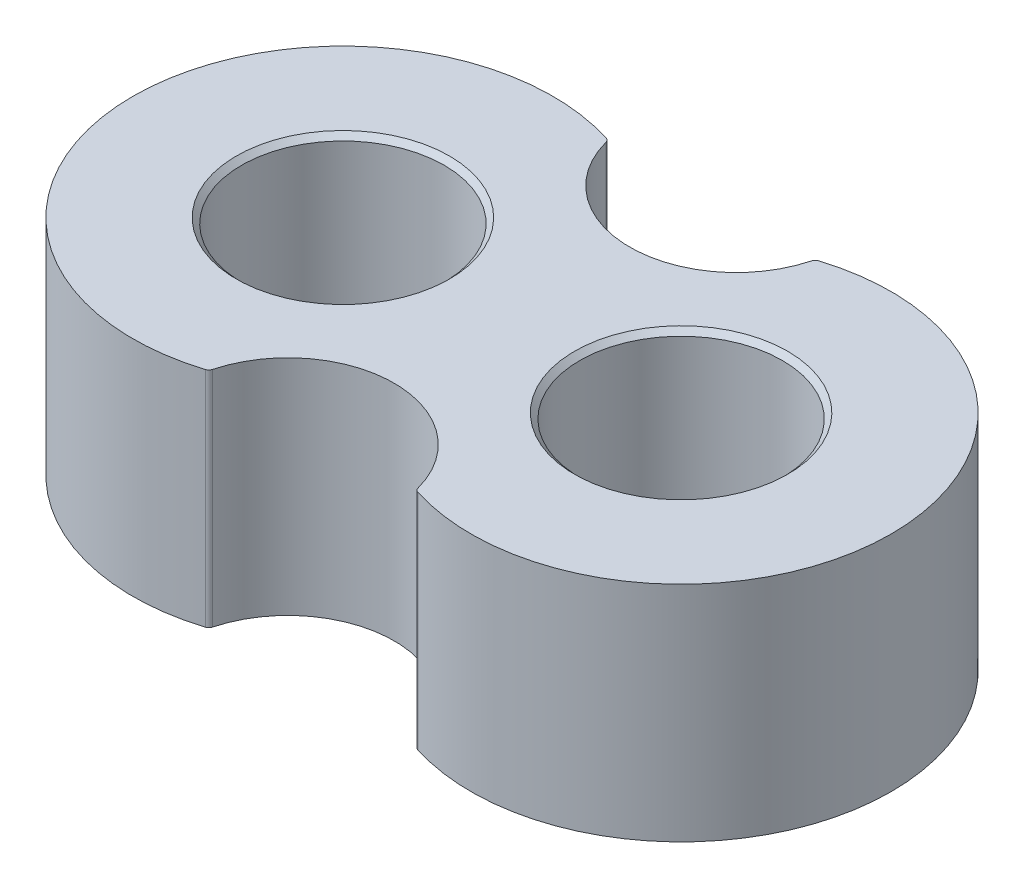
ISO-10303-21;
HEADER;
FILE_DESCRIPTION(('STEP AP214'),'2;1');
FILE_NAME('part.step','',(''),(''),'','','');
FILE_SCHEMA(('AUTOMOTIVE_DESIGN { 1 0 10303 214 1 1 1 1 }'));
ENDSEC;
DATA;
#1=APPLICATION_CONTEXT('core data for automotive mechanical design processes');
#2=APPLICATION_PROTOCOL_DEFINITION('international standard','automotive_design',2000,#1);
#3=PRODUCT_CONTEXT('',#1,'mechanical');
#4=PRODUCT('Part','Part','',(#3));
#5=PRODUCT_RELATED_PRODUCT_CATEGORY('part','',(#4));
#6=PRODUCT_DEFINITION_FORMATION('','',#4);
#7=PRODUCT_DEFINITION_CONTEXT('part definition',#1,'design');
#8=PRODUCT_DEFINITION('design','',#6,#7);
#9=PRODUCT_DEFINITION_SHAPE('','',#8);
#10=(LENGTH_UNIT() NAMED_UNIT(*) SI_UNIT(.MILLI.,.METRE.));
#11=(NAMED_UNIT(*) PLANE_ANGLE_UNIT() SI_UNIT($,.RADIAN.));
#12=(NAMED_UNIT(*) SI_UNIT($,.STERADIAN.) SOLID_ANGLE_UNIT());
#13=UNCERTAINTY_MEASURE_WITH_UNIT(LENGTH_MEASURE(1.E-05),#10,'distance_accuracy_value','');
#14=(GEOMETRIC_REPRESENTATION_CONTEXT(3) GLOBAL_UNCERTAINTY_ASSIGNED_CONTEXT((#13)) GLOBAL_UNIT_ASSIGNED_CONTEXT((#10,
#11,#12)) REPRESENTATION_CONTEXT('',''));
#15=CARTESIAN_POINT('',(0.,0.,0.));
#16=DIRECTION('',(0.,0.,1.));
#17=DIRECTION('',(1.,0.,0.));
#18=AXIS2_PLACEMENT_3D('',#15,#16,#17);
#19=CARTESIAN_POINT('',(-13.0227641960405,20.985,9.18488645157975));
#20=DIRECTION('',(0.,-1.,0.));
#21=DIRECTION('',(0.,0.,-1.));
#22=AXIS2_PLACEMENT_3D('',#19,#20,#21);
#23=PLANE('',#22);
#24=CARTESIAN_POINT('',(15.9,20.985,0.));
#25=DIRECTION('',(0.,-1.,0.));
#26=DIRECTION('',(0.,0.,-1.));
#27=AXIS2_PLACEMENT_3D('',#24,#25,#26);
#28=CIRCLE('',#27,10.025);
#29=CARTESIAN_POINT('',(15.9,20.985,-10.025));
#30=VERTEX_POINT('',#29);
#31=EDGE_CURVE('E11',#30,#30,#28,.T.);
#32=ORIENTED_EDGE('',*,*,#31,.T.);
#33=EDGE_LOOP('',(#32));
#34=FACE_BOUND('',#33,.T.);
#35=CARTESIAN_POINT('',(-15.9,20.985,0.));
#36=DIRECTION('',(0.,-1.,0.));
#37=DIRECTION('',(0.,0.,-1.));
#38=AXIS2_PLACEMENT_3D('',#35,#36,#37);
#39=CIRCLE('',#38,10.025);
#40=CARTESIAN_POINT('',(-15.9,20.985,-10.025));
#41=VERTEX_POINT('',#40);
#42=EDGE_CURVE('E49',#41,#41,#39,.T.);
#43=ORIENTED_EDGE('',*,*,#42,.T.);
#44=EDGE_LOOP('',(#43));
#45=FACE_BOUND('',#44,.T.);
#46=CARTESIAN_POINT('',(-10.1455283920809,20.985,18.3697729031595));
#47=DIRECTION('',(0.,1.,0.));
#48=DIRECTION('',(0.,0.,-1.));
#49=AXIS2_PLACEMENT_3D('',#46,#47,#48);
#50=CIRCLE('',#49,0.499999999999998);
#51=CARTESIAN_POINT('',(-9.99606159707003,20.985,18.8469098616831));
#52=VERTEX_POINT('',#51);
#53=CARTESIAN_POINT('',(-9.66240799245801,20.985,18.4985932411043));
#54=VERTEX_POINT('',#53);
#55=EDGE_CURVE('E151',#52,#54,#50,.T.);
#56=ORIENTED_EDGE('',*,*,#55,.T.);
#57=CARTESIAN_POINT('',(0.,20.985,21.075));
#58=DIRECTION('',(0.,-1.,0.));
#59=DIRECTION('',(0.,0.,-1.));
#60=AXIS2_PLACEMENT_3D('',#57,#58,#59);
#61=CIRCLE('',#60,10.);
#62=CARTESIAN_POINT('',(9.66240799245801,20.985,18.4985932411043));
#63=VERTEX_POINT('',#62);
#64=EDGE_CURVE('E101',#54,#63,#61,.T.);
#65=ORIENTED_EDGE('',*,*,#64,.T.);
#66=CARTESIAN_POINT('',(10.1455283920809,20.985,18.3697729031595));
#67=DIRECTION('',(0.,1.,0.));
#68=DIRECTION('',(0.,0.,1.));
#69=AXIS2_PLACEMENT_3D('',#66,#67,#68);
#70=CIRCLE('',#69,0.499999999999999);
#71=CARTESIAN_POINT('',(9.99606159707003,20.985,18.8469098616831));
#72=VERTEX_POINT('',#71);
#73=EDGE_CURVE('E396',#63,#72,#70,.T.);
#74=ORIENTED_EDGE('',*,*,#73,.T.);
#75=CARTESIAN_POINT('',(15.9,20.985,0.));
#76=DIRECTION('',(0.,1.,0.));
#77=DIRECTION('',(0.,0.,1.));
#78=AXIS2_PLACEMENT_3D('',#75,#76,#77);
#79=CIRCLE('',#78,19.75);
#80=CARTESIAN_POINT('',(9.99606159707002,20.985,-18.8469098616831));
#81=VERTEX_POINT('',#80);
#82=EDGE_CURVE('E400',#72,#81,#79,.T.);
#83=ORIENTED_EDGE('',*,*,#82,.T.);
#84=CARTESIAN_POINT('',(10.1455283920809,20.985,-18.3697729031595));
#85=DIRECTION('',(0.,1.,0.));
#86=DIRECTION('',(0.,0.,1.));
#87=AXIS2_PLACEMENT_3D('',#84,#85,#86);
#88=CIRCLE('',#87,0.499999999999999);
#89=CARTESIAN_POINT('',(9.66240799245801,20.985,-18.4985932411043));
#90=VERTEX_POINT('',#89);
#91=EDGE_CURVE('E119',#81,#90,#88,.T.);
#92=ORIENTED_EDGE('',*,*,#91,.T.);
#93=CARTESIAN_POINT('',(0.,20.985,-21.075));
#94=DIRECTION('',(0.,-1.,0.));
#95=DIRECTION('',(0.,0.,1.));
#96=AXIS2_PLACEMENT_3D('',#93,#94,#95);
#97=CIRCLE('',#96,10.);
#98=CARTESIAN_POINT('',(-9.66240799245801,20.985,-18.4985932411043));
#99=VERTEX_POINT('',#98);
#100=EDGE_CURVE('E114',#90,#99,#97,.T.);
#101=ORIENTED_EDGE('',*,*,#100,.T.);
#102=CARTESIAN_POINT('',(-10.1455283920809,20.985,-18.3697729031595));
#103=DIRECTION('',(0.,1.,0.));
#104=DIRECTION('',(0.,0.,-1.));
#105=AXIS2_PLACEMENT_3D('',#102,#103,#104);
#106=CIRCLE('',#105,0.499999999999998);
#107=CARTESIAN_POINT('',(-9.99606159707003,20.985,-18.8469098616831));
#108=VERTEX_POINT('',#107);
#109=EDGE_CURVE('E117',#99,#108,#106,.T.);
#110=ORIENTED_EDGE('',*,*,#109,.T.);
#111=CARTESIAN_POINT('',(-15.9,20.985,0.));
#112=DIRECTION('',(0.,1.,0.));
#113=DIRECTION('',(0.,0.,-1.));
#114=AXIS2_PLACEMENT_3D('',#111,#112,#113);
#115=CIRCLE('',#114,19.75);
#116=EDGE_CURVE('E57',#108,#52,#115,.T.);
#117=ORIENTED_EDGE('',*,*,#116,.T.);
#118=EDGE_LOOP('',(#56,#65,#74,#83,#92,#101,#110,#117));
#119=FACE_BOUND('',#118,.T.);
#120=ADVANCED_FACE('F39',(#34,#45,#119),#23,.F.);
#121=CARTESIAN_POINT('',(-13.0227641960405,0.,9.18488645157975));
#122=DIRECTION('',(0.,-1.,0.));
#123=DIRECTION('',(0.,0.,-1.));
#124=AXIS2_PLACEMENT_3D('',#121,#122,#123);
#125=PLANE('',#124);
#126=CARTESIAN_POINT('',(-15.9,0.,0.));
#127=DIRECTION('',(0.,-1.,0.));
#128=DIRECTION('',(0.,0.,-1.));
#129=AXIS2_PLACEMENT_3D('',#126,#127,#128);
#130=CIRCLE('',#129,10.025);
#131=CARTESIAN_POINT('',(-15.9,0.,-10.025));
#132=VERTEX_POINT('',#131);
#133=EDGE_CURVE('E169',#132,#132,#130,.F.);
#134=ORIENTED_EDGE('',*,*,#133,.T.);
#135=EDGE_LOOP('',(#134));
#136=FACE_BOUND('',#135,.T.);
#137=CARTESIAN_POINT('',(15.9,0.,0.));
#138=DIRECTION('',(0.,-1.,0.));
#139=DIRECTION('',(0.,0.,-1.));
#140=AXIS2_PLACEMENT_3D('',#137,#138,#139);
#141=CIRCLE('',#140,10.025);
#142=CARTESIAN_POINT('',(15.9,0.,-10.025));
#143=VERTEX_POINT('',#142);
#144=EDGE_CURVE('E166',#143,#143,#141,.F.);
#145=ORIENTED_EDGE('',*,*,#144,.T.);
#146=EDGE_LOOP('',(#145));
#147=FACE_BOUND('',#146,.T.);
#148=CARTESIAN_POINT('',(-10.1455283920809,0.,18.3697729031595));
#149=DIRECTION('',(0.,1.,0.));
#150=DIRECTION('',(0.,0.,-1.));
#151=AXIS2_PLACEMENT_3D('',#148,#149,#150);
#152=CIRCLE('',#151,0.499999999999998);
#153=CARTESIAN_POINT('',(-9.99606159707003,0.,18.8469098616831));
#154=VERTEX_POINT('',#153);
#155=CARTESIAN_POINT('',(-9.66240799245801,0.,18.4985932411043));
#156=VERTEX_POINT('',#155);
#157=EDGE_CURVE('E137',#154,#156,#152,.T.);
#158=ORIENTED_EDGE('',*,*,#157,.F.);
#159=CARTESIAN_POINT('',(-15.9,0.,0.));
#160=DIRECTION('',(0.,1.,0.));
#161=DIRECTION('',(0.,0.,-1.));
#162=AXIS2_PLACEMENT_3D('',#159,#160,#161);
#163=CIRCLE('',#162,19.75);
#164=CARTESIAN_POINT('',(-9.99606159707003,0.,-18.8469098616831));
#165=VERTEX_POINT('',#164);
#166=EDGE_CURVE('E92',#165,#154,#163,.T.);
#167=ORIENTED_EDGE('',*,*,#166,.F.);
#168=CARTESIAN_POINT('',(-10.1455283920809,0.,-18.3697729031595));
#169=DIRECTION('',(0.,1.,0.));
#170=DIRECTION('',(0.,0.,-1.));
#171=AXIS2_PLACEMENT_3D('',#168,#169,#170);
#172=CIRCLE('',#171,0.499999999999998);
#173=CARTESIAN_POINT('',(-9.66240799245801,0.,-18.4985932411043));
#174=VERTEX_POINT('',#173);
#175=EDGE_CURVE('E86',#174,#165,#172,.T.);
#176=ORIENTED_EDGE('',*,*,#175,.F.);
#177=CARTESIAN_POINT('',(0.,0.,-21.075));
#178=DIRECTION('',(0.,-1.,0.));
#179=DIRECTION('',(0.,0.,1.));
#180=AXIS2_PLACEMENT_3D('',#177,#178,#179);
#181=CIRCLE('',#180,10.);
#182=CARTESIAN_POINT('',(9.66240799245801,0.,-18.4985932411043));
#183=VERTEX_POINT('',#182);
#184=EDGE_CURVE('E127',#183,#174,#181,.T.);
#185=ORIENTED_EDGE('',*,*,#184,.F.);
#186=CARTESIAN_POINT('',(10.1455283920809,0.,-18.3697729031595));
#187=DIRECTION('',(0.,1.,0.));
#188=DIRECTION('',(0.,0.,1.));
#189=AXIS2_PLACEMENT_3D('',#186,#187,#188);
#190=CIRCLE('',#189,0.499999999999999);
#191=CARTESIAN_POINT('',(9.99606159707002,0.,-18.8469098616831));
#192=VERTEX_POINT('',#191);
#193=EDGE_CURVE('E146',#192,#183,#190,.T.);
#194=ORIENTED_EDGE('',*,*,#193,.F.);
#195=CARTESIAN_POINT('',(15.9,0.,0.));
#196=DIRECTION('',(0.,1.,0.));
#197=DIRECTION('',(0.,0.,1.));
#198=AXIS2_PLACEMENT_3D('',#195,#196,#197);
#199=CIRCLE('',#198,19.75);
#200=CARTESIAN_POINT('',(9.99606159707003,0.,18.8469098616831));
#201=VERTEX_POINT('',#200);
#202=EDGE_CURVE('E144',#201,#192,#199,.T.);
#203=ORIENTED_EDGE('',*,*,#202,.F.);
#204=CARTESIAN_POINT('',(10.1455283920809,0.,18.3697729031595));
#205=DIRECTION('',(0.,1.,0.));
#206=DIRECTION('',(0.,0.,1.));
#207=AXIS2_PLACEMENT_3D('',#204,#205,#206);
#208=CIRCLE('',#207,0.499999999999999);
#209=CARTESIAN_POINT('',(9.66240799245801,0.,18.4985932411043));
#210=VERTEX_POINT('',#209);
#211=EDGE_CURVE('E142',#210,#201,#208,.T.);
#212=ORIENTED_EDGE('',*,*,#211,.F.);
#213=CARTESIAN_POINT('',(0.,0.,21.075));
#214=DIRECTION('',(0.,-1.,0.));
#215=DIRECTION('',(0.,0.,-1.));
#216=AXIS2_PLACEMENT_3D('',#213,#214,#215);
#217=CIRCLE('',#216,10.);
#218=EDGE_CURVE('E140',#156,#210,#217,.T.);
#219=ORIENTED_EDGE('',*,*,#218,.F.);
#220=EDGE_LOOP('',(#158,#167,#176,#185,#194,#203,#212,#219));
#221=FACE_BOUND('',#220,.T.);
#222=ADVANCED_FACE('F208',(#136,#147,#221),#125,.T.);
#223=CARTESIAN_POINT('',(-10.1455283920809,20.985,18.3697729031595));
#224=DIRECTION('',(0.,-1.,0.));
#225=DIRECTION('',(0.,0.,-1.));
#226=AXIS2_PLACEMENT_3D('',#223,#224,#225);
#227=CYLINDRICAL_SURFACE('',#226,0.499999999999998);
#228=ORIENTED_EDGE('',*,*,#157,.T.);
#229=DIRECTION('',(0.,-1.,0.));
#230=VECTOR('',#229,1.);
#231=CARTESIAN_POINT('',(-9.66240799245801,20.985,18.4985932411043));
#232=LINE('',#231,#230);
#233=EDGE_CURVE('E164',#54,#156,#232,.T.);
#234=ORIENTED_EDGE('',*,*,#233,.F.);
#235=ORIENTED_EDGE('',*,*,#55,.F.);
#236=DIRECTION('',(0.,-1.,0.));
#237=VECTOR('',#236,1.);
#238=CARTESIAN_POINT('',(-9.99606159707003,20.985,18.8469098616831));
#239=LINE('',#238,#237);
#240=EDGE_CURVE('E133',#52,#154,#239,.T.);
#241=ORIENTED_EDGE('',*,*,#240,.T.);
#242=EDGE_LOOP('',(#228,#234,#235,#241));
#243=FACE_BOUND('',#242,.T.);
#244=ADVANCED_FACE('F213',(#243),#227,.T.);
#245=CARTESIAN_POINT('',(0.,20.985,21.075));
#246=DIRECTION('',(0.,-1.,0.));
#247=DIRECTION('',(0.,0.,-1.));
#248=AXIS2_PLACEMENT_3D('',#245,#246,#247);
#249=CYLINDRICAL_SURFACE('',#248,10.);
#250=ORIENTED_EDGE('',*,*,#218,.T.);
#251=DIRECTION('',(0.,-1.,0.));
#252=VECTOR('',#251,1.);
#253=CARTESIAN_POINT('',(9.66240799245801,20.985,18.4985932411043));
#254=LINE('',#253,#252);
#255=EDGE_CURVE('E161',#63,#210,#254,.T.);
#256=ORIENTED_EDGE('',*,*,#255,.F.);
#257=ORIENTED_EDGE('',*,*,#64,.F.);
#258=ORIENTED_EDGE('',*,*,#233,.T.);
#259=EDGE_LOOP('',(#250,#256,#257,#258));
#260=FACE_BOUND('',#259,.T.);
#261=ADVANCED_FACE('F232',(#260),#249,.F.);
#262=CARTESIAN_POINT('',(10.1455283920809,20.985,18.3697729031595));
#263=DIRECTION('',(0.,-1.,0.));
#264=DIRECTION('',(0.,0.,-1.));
#265=AXIS2_PLACEMENT_3D('',#262,#263,#264);
#266=CYLINDRICAL_SURFACE('',#265,0.499999999999999);
#267=ORIENTED_EDGE('',*,*,#211,.T.);
#268=DIRECTION('',(0.,-1.,0.));
#269=VECTOR('',#268,1.);
#270=CARTESIAN_POINT('',(9.99606159707003,20.985,18.8469098616831));
#271=LINE('',#270,#269);
#272=EDGE_CURVE('E158',#72,#201,#271,.T.);
#273=ORIENTED_EDGE('',*,*,#272,.F.);
#274=ORIENTED_EDGE('',*,*,#73,.F.);
#275=ORIENTED_EDGE('',*,*,#255,.T.);
#276=EDGE_LOOP('',(#267,#273,#274,#275));
#277=FACE_BOUND('',#276,.T.);
#278=ADVANCED_FACE('F228',(#277),#266,.T.);
#279=CARTESIAN_POINT('',(15.9,20.985,0.));
#280=DIRECTION('',(0.,-1.,0.));
#281=DIRECTION('',(0.,0.,-1.));
#282=AXIS2_PLACEMENT_3D('',#279,#280,#281);
#283=CYLINDRICAL_SURFACE('',#282,19.75);
#284=ORIENTED_EDGE('',*,*,#202,.T.);
#285=DIRECTION('',(0.,-1.,0.));
#286=VECTOR('',#285,1.);
#287=CARTESIAN_POINT('',(9.99606159707002,20.985,-18.8469098616831));
#288=LINE('',#287,#286);
#289=EDGE_CURVE('E155',#81,#192,#288,.T.);
#290=ORIENTED_EDGE('',*,*,#289,.F.);
#291=ORIENTED_EDGE('',*,*,#82,.F.);
#292=ORIENTED_EDGE('',*,*,#272,.T.);
#293=EDGE_LOOP('',(#284,#290,#291,#292));
#294=FACE_BOUND('',#293,.T.);
#295=ADVANCED_FACE('F224',(#294),#283,.T.);
#296=CARTESIAN_POINT('',(10.1455283920809,20.985,-18.3697729031595));
#297=DIRECTION('',(0.,-1.,0.));
#298=DIRECTION('',(0.,0.,-1.));
#299=AXIS2_PLACEMENT_3D('',#296,#297,#298);
#300=CYLINDRICAL_SURFACE('',#299,0.499999999999999);
#301=ORIENTED_EDGE('',*,*,#193,.T.);
#302=DIRECTION('',(0.,-1.,0.));
#303=VECTOR('',#302,1.);
#304=CARTESIAN_POINT('',(9.66240799245801,20.985,-18.4985932411043));
#305=LINE('',#304,#303);
#306=EDGE_CURVE('E128',#90,#183,#305,.T.);
#307=ORIENTED_EDGE('',*,*,#306,.F.);
#308=ORIENTED_EDGE('',*,*,#91,.F.);
#309=ORIENTED_EDGE('',*,*,#289,.T.);
#310=EDGE_LOOP('',(#301,#307,#308,#309));
#311=FACE_BOUND('',#310,.T.);
#312=ADVANCED_FACE('F221',(#311),#300,.T.);
#313=CARTESIAN_POINT('',(0.,20.985,-21.075));
#314=DIRECTION('',(0.,-1.,0.));
#315=DIRECTION('',(0.,0.,-1.));
#316=AXIS2_PLACEMENT_3D('',#313,#314,#315);
#317=CYLINDRICAL_SURFACE('',#316,10.);
#318=ORIENTED_EDGE('',*,*,#184,.T.);
#319=DIRECTION('',(0.,-1.,0.));
#320=VECTOR('',#319,1.);
#321=CARTESIAN_POINT('',(-9.66240799245801,20.985,-18.4985932411043));
#322=LINE('',#321,#320);
#323=EDGE_CURVE('E124',#99,#174,#322,.T.);
#324=ORIENTED_EDGE('',*,*,#323,.F.);
#325=ORIENTED_EDGE('',*,*,#100,.F.);
#326=ORIENTED_EDGE('',*,*,#306,.T.);
#327=EDGE_LOOP('',(#318,#324,#325,#326));
#328=FACE_BOUND('',#327,.T.);
#329=ADVANCED_FACE('F125',(#328),#317,.F.);
#330=CARTESIAN_POINT('',(-10.1455283920809,20.985,-18.3697729031595));
#331=DIRECTION('',(0.,-1.,0.));
#332=DIRECTION('',(0.,0.,-1.));
#333=AXIS2_PLACEMENT_3D('',#330,#331,#332);
#334=CYLINDRICAL_SURFACE('',#333,0.499999999999998);
#335=ORIENTED_EDGE('',*,*,#175,.T.);
#336=DIRECTION('',(0.,-1.,0.));
#337=VECTOR('',#336,1.);
#338=CARTESIAN_POINT('',(-9.99606159707003,20.985,-18.8469098616831));
#339=LINE('',#338,#337);
#340=EDGE_CURVE('E129',#108,#165,#339,.T.);
#341=ORIENTED_EDGE('',*,*,#340,.F.);
#342=ORIENTED_EDGE('',*,*,#109,.F.);
#343=ORIENTED_EDGE('',*,*,#323,.T.);
#344=EDGE_LOOP('',(#335,#341,#342,#343));
#345=FACE_BOUND('',#344,.T.);
#346=ADVANCED_FACE('F131',(#345),#334,.T.);
#347=CARTESIAN_POINT('',(-15.9,20.985,0.));
#348=DIRECTION('',(0.,-1.,0.));
#349=DIRECTION('',(0.,0.,-1.));
#350=AXIS2_PLACEMENT_3D('',#347,#348,#349);
#351=CYLINDRICAL_SURFACE('',#350,19.75);
#352=ORIENTED_EDGE('',*,*,#166,.T.);
#353=ORIENTED_EDGE('',*,*,#240,.F.);
#354=ORIENTED_EDGE('',*,*,#116,.F.);
#355=ORIENTED_EDGE('',*,*,#340,.T.);
#356=EDGE_LOOP('',(#352,#353,#354,#355));
#357=FACE_BOUND('',#356,.T.);
#358=ADVANCED_FACE('F195',(#357),#351,.T.);
#359=CARTESIAN_POINT('',(-15.9,20.985,0.));
#360=DIRECTION('',(0.,-1.,0.));
#361=DIRECTION('',(0.,0.,-1.));
#362=AXIS2_PLACEMENT_3D('',#359,#360,#361);
#363=CYLINDRICAL_SURFACE('',#362,9.525);
#364=CARTESIAN_POINT('',(-15.9,0.499999999999983,0.));
#365=DIRECTION('',(0.,-1.,0.));
#366=DIRECTION('',(0.,0.,-1.));
#367=AXIS2_PLACEMENT_3D('',#364,#365,#366);
#368=CIRCLE('',#367,9.525);
#369=CARTESIAN_POINT('',(-15.9,0.499999999999983,-9.525));
#370=VERTEX_POINT('',#369);
#371=EDGE_CURVE('E175',#370,#370,#368,.T.);
#372=ORIENTED_EDGE('',*,*,#371,.T.);
#373=EDGE_LOOP('',(#372));
#374=FACE_BOUND('',#373,.T.);
#375=CARTESIAN_POINT('',(-15.9,20.485,0.));
#376=DIRECTION('',(0.,-1.,0.));
#377=DIRECTION('',(0.,0.,-1.));
#378=AXIS2_PLACEMENT_3D('',#375,#376,#377);
#379=CIRCLE('',#378,9.525);
#380=CARTESIAN_POINT('',(-15.9,20.485,-9.525));
#381=VERTEX_POINT('',#380);
#382=EDGE_CURVE('E172',#381,#381,#379,.F.);
#383=ORIENTED_EDGE('',*,*,#382,.T.);
#384=EDGE_LOOP('',(#383));
#385=FACE_BOUND('',#384,.T.);
#386=ADVANCED_FACE('F192',(#374,#385),#363,.F.);
#387=CARTESIAN_POINT('',(15.9,20.985,0.));
#388=DIRECTION('',(0.,-1.,0.));
#389=DIRECTION('',(0.,0.,-1.));
#390=AXIS2_PLACEMENT_3D('',#387,#388,#389);
#391=CYLINDRICAL_SURFACE('',#390,9.525);
#392=CARTESIAN_POINT('',(15.9,0.500000000000004,0.));
#393=DIRECTION('',(0.,-1.,0.));
#394=DIRECTION('',(0.,0.,-1.));
#395=AXIS2_PLACEMENT_3D('',#392,#393,#394);
#396=CIRCLE('',#395,9.525);
#397=CARTESIAN_POINT('',(15.9,0.500000000000004,-9.525));
#398=VERTEX_POINT('',#397);
#399=EDGE_CURVE('E181',#398,#398,#396,.T.);
#400=ORIENTED_EDGE('',*,*,#399,.T.);
#401=EDGE_LOOP('',(#400));
#402=FACE_BOUND('',#401,.T.);
#403=CARTESIAN_POINT('',(15.9,20.485,0.));
#404=DIRECTION('',(0.,-1.,0.));
#405=DIRECTION('',(0.,0.,-1.));
#406=AXIS2_PLACEMENT_3D('',#403,#404,#405);
#407=CIRCLE('',#406,9.525);
#408=CARTESIAN_POINT('',(15.9,20.485,-9.525));
#409=VERTEX_POINT('',#408);
#410=EDGE_CURVE('E178',#409,#409,#407,.F.);
#411=ORIENTED_EDGE('',*,*,#410,.T.);
#412=EDGE_LOOP('',(#411));
#413=FACE_BOUND('',#412,.T.);
#414=ADVANCED_FACE('F194',(#402,#413),#391,.F.);
#415=CARTESIAN_POINT('',(-15.9,0.,0.));
#416=DIRECTION('',(0.,-1.,0.));
#417=DIRECTION('',(0.,0.,-1.));
#418=AXIS2_PLACEMENT_3D('',#415,#416,#417);
#419=CONICAL_SURFACE('',#418,10.025,0.785398163397443);
#420=ORIENTED_EDGE('',*,*,#371,.F.);
#421=EDGE_LOOP('',(#420));
#422=FACE_BOUND('',#421,.T.);
#423=ORIENTED_EDGE('',*,*,#133,.F.);
#424=EDGE_LOOP('',(#423));
#425=FACE_BOUND('',#424,.T.);
#426=ADVANCED_FACE('F202',(#422,#425),#419,.F.);
#427=CARTESIAN_POINT('',(15.9,0.,0.));
#428=DIRECTION('',(0.,-1.,0.));
#429=DIRECTION('',(0.,0.,-1.));
#430=AXIS2_PLACEMENT_3D('',#427,#428,#429);
#431=CONICAL_SURFACE('',#430,10.025,0.785398163397447);
#432=ORIENTED_EDGE('',*,*,#399,.F.);
#433=EDGE_LOOP('',(#432));
#434=FACE_BOUND('',#433,.T.);
#435=ORIENTED_EDGE('',*,*,#144,.F.);
#436=EDGE_LOOP('',(#435));
#437=FACE_BOUND('',#436,.T.);
#438=ADVANCED_FACE('F245',(#434,#437),#431,.F.);
#439=CARTESIAN_POINT('',(15.9,20.485,0.));
#440=DIRECTION('',(0.,1.,0.));
#441=DIRECTION('',(0.,0.,1.));
#442=AXIS2_PLACEMENT_3D('',#439,#440,#441);
#443=CONICAL_SURFACE('',#442,9.525,0.785398163397453);
#444=ORIENTED_EDGE('',*,*,#31,.F.);
#445=EDGE_LOOP('',(#444));
#446=FACE_BOUND('',#445,.T.);
#447=ORIENTED_EDGE('',*,*,#410,.F.);
#448=EDGE_LOOP('',(#447));
#449=FACE_BOUND('',#448,.T.);
#450=ADVANCED_FACE('F189',(#446,#449),#443,.F.);
#451=CARTESIAN_POINT('',(-15.9,20.485,0.));
#452=DIRECTION('',(0.,1.,0.));
#453=DIRECTION('',(0.,0.,1.));
#454=AXIS2_PLACEMENT_3D('',#451,#452,#453);
#455=CONICAL_SURFACE('',#454,9.525,0.785398163397447);
#456=ORIENTED_EDGE('',*,*,#42,.F.);
#457=EDGE_LOOP('',(#456));
#458=FACE_BOUND('',#457,.T.);
#459=ORIENTED_EDGE('',*,*,#382,.F.);
#460=EDGE_LOOP('',(#459));
#461=FACE_BOUND('',#460,.T.);
#462=ADVANCED_FACE('F42',(#458,#461),#455,.F.);
#463=CLOSED_SHELL('',(#120,#222,#244,#261,#278,#295,#312,#329,#346,#358,#386,#414,#426,#438,
#450,#462));
#464=MANIFOLD_SOLID_BREP('B2',#463);
#465=ADVANCED_BREP_SHAPE_REPRESENTATION('',(#18,#464),#14);
#466=SHAPE_DEFINITION_REPRESENTATION(#9,#465);
ENDSEC;
END-ISO-10303-21;
